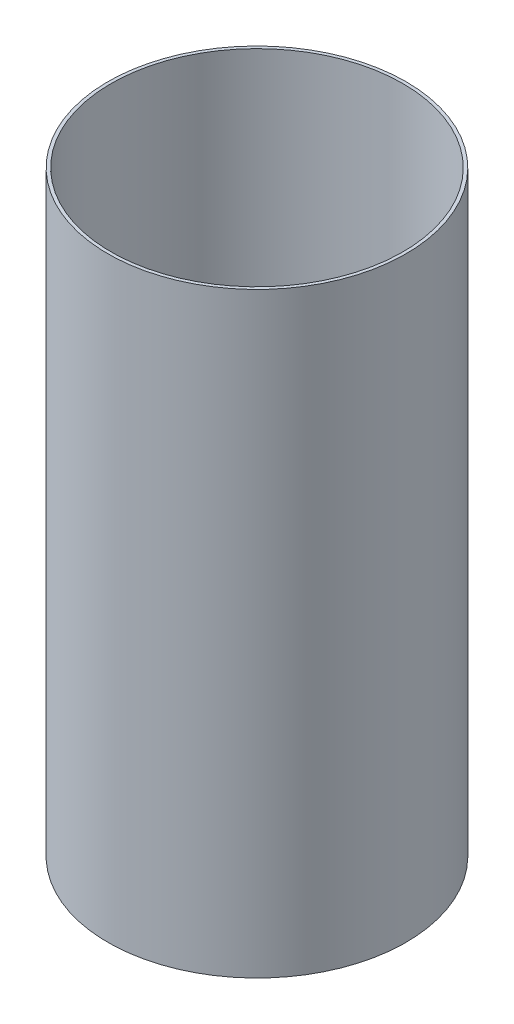
ISO-10303-21;
HEADER;
FILE_DESCRIPTION(('STEP AP214'),'2;1');
FILE_NAME('part.step','',(''),(''),'','','');
FILE_SCHEMA(('AUTOMOTIVE_DESIGN { 1 0 10303 214 1 1 1 1 }'));
ENDSEC;
DATA;
#1=APPLICATION_CONTEXT('core data for automotive mechanical design processes');
#2=APPLICATION_PROTOCOL_DEFINITION('international standard','automotive_design',2000,#1);
#3=PRODUCT_CONTEXT('',#1,'mechanical');
#4=PRODUCT('Part','Part','',(#3));
#5=PRODUCT_RELATED_PRODUCT_CATEGORY('part','',(#4));
#6=PRODUCT_DEFINITION_FORMATION('','',#4);
#7=PRODUCT_DEFINITION_CONTEXT('part definition',#1,'design');
#8=PRODUCT_DEFINITION('design','',#6,#7);
#9=PRODUCT_DEFINITION_SHAPE('','',#8);
#10=(LENGTH_UNIT() NAMED_UNIT(*) SI_UNIT(.MILLI.,.METRE.));
#11=(NAMED_UNIT(*) PLANE_ANGLE_UNIT() SI_UNIT($,.RADIAN.));
#12=(NAMED_UNIT(*) SI_UNIT($,.STERADIAN.) SOLID_ANGLE_UNIT());
#13=UNCERTAINTY_MEASURE_WITH_UNIT(LENGTH_MEASURE(1.E-05),#10,'distance_accuracy_value','');
#14=(GEOMETRIC_REPRESENTATION_CONTEXT(3) GLOBAL_UNCERTAINTY_ASSIGNED_CONTEXT((#13)) GLOBAL_UNIT_ASSIGNED_CONTEXT((#10,
#11,#12)) REPRESENTATION_CONTEXT('',''));
#15=CARTESIAN_POINT('',(0.,0.,0.));
#16=DIRECTION('',(0.,0.,1.));
#17=DIRECTION('',(1.,0.,0.));
#18=AXIS2_PLACEMENT_3D('',#15,#16,#17);
#19=CARTESIAN_POINT('',(0.,313.4,0.));
#20=DIRECTION('',(0.,1.,0.));
#21=DIRECTION('',(0.,0.,1.));
#22=AXIS2_PLACEMENT_3D('',#19,#20,#21);
#23=PLANE('',#22);
#24=CARTESIAN_POINT('',(0.,313.4,0.));
#25=DIRECTION('',(0.,1.,0.));
#26=DIRECTION('',(0.,0.,1.));
#27=AXIS2_PLACEMENT_3D('',#24,#25,#26);
#28=CIRCLE('',#27,78.35);
#29=CARTESIAN_POINT('',(0.,313.4,-78.35));
#30=VERTEX_POINT('',#29);
#31=EDGE_CURVE('E10',#30,#30,#28,.T.);
#32=ORIENTED_EDGE('',*,*,#31,.T.);
#33=EDGE_LOOP('',(#32));
#34=FACE_BOUND('',#33,.T.);
#35=CARTESIAN_POINT('',(0.,313.4,0.));
#36=DIRECTION('',(0.,1.,0.));
#37=DIRECTION('',(0.,0.,1.));
#38=AXIS2_PLACEMENT_3D('',#35,#36,#37);
#39=CIRCLE('',#38,76.67);
#40=CARTESIAN_POINT('',(0.,313.4,-76.67));
#41=VERTEX_POINT('',#40);
#42=EDGE_CURVE('E47',#41,#41,#39,.T.);
#43=ORIENTED_EDGE('',*,*,#42,.F.);
#44=EDGE_LOOP('',(#43));
#45=FACE_BOUND('',#44,.T.);
#46=ADVANCED_FACE('F36',(#34,#45),#23,.T.);
#47=CARTESIAN_POINT('',(0.,0.,0.));
#48=DIRECTION('',(0.,1.,0.));
#49=DIRECTION('',(0.,0.,1.));
#50=AXIS2_PLACEMENT_3D('',#47,#48,#49);
#51=PLANE('',#50);
#52=CARTESIAN_POINT('',(0.,0.,0.));
#53=DIRECTION('',(0.,1.,0.));
#54=DIRECTION('',(0.,0.,1.));
#55=AXIS2_PLACEMENT_3D('',#52,#53,#54);
#56=CIRCLE('',#55,78.35);
#57=CARTESIAN_POINT('',(0.,0.,-78.35));
#58=VERTEX_POINT('',#57);
#59=EDGE_CURVE('E40',#58,#58,#56,.T.);
#60=ORIENTED_EDGE('',*,*,#59,.F.);
#61=EDGE_LOOP('',(#60));
#62=FACE_BOUND('',#61,.T.);
#63=CARTESIAN_POINT('',(0.,0.,0.));
#64=DIRECTION('',(0.,1.,0.));
#65=DIRECTION('',(0.,0.,1.));
#66=AXIS2_PLACEMENT_3D('',#63,#64,#65);
#67=CIRCLE('',#66,76.67);
#68=CARTESIAN_POINT('',(0.,0.,-76.67));
#69=VERTEX_POINT('',#68);
#70=EDGE_CURVE('E49',#69,#69,#67,.T.);
#71=ORIENTED_EDGE('',*,*,#70,.T.);
#72=EDGE_LOOP('',(#71));
#73=FACE_BOUND('',#72,.T.);
#74=ADVANCED_FACE('F59',(#62,#73),#51,.F.);
#75=CARTESIAN_POINT('',(0.,313.4,0.));
#76=DIRECTION('',(0.,-1.,0.));
#77=DIRECTION('',(0.,0.,-1.));
#78=AXIS2_PLACEMENT_3D('',#75,#76,#77);
#79=CYLINDRICAL_SURFACE('',#78,78.35);
#80=CARTESIAN_POINT('',(0.,313.4,-78.35));
#81=CARTESIAN_POINT('',(0.,310.135416666667,-78.35));
#82=CARTESIAN_POINT('',(0.,306.870833333333,-78.35));
#83=CARTESIAN_POINT('',(0.,300.341666666667,-78.35));
#84=CARTESIAN_POINT('',(0.,297.077083333333,-78.35));
#85=CARTESIAN_POINT('',(0.,290.547916666667,-78.35));
#86=CARTESIAN_POINT('',(0.,287.283333333333,-78.35));
#87=CARTESIAN_POINT('',(0.,280.754166666667,-78.35));
#88=CARTESIAN_POINT('',(0.,277.489583333333,-78.35));
#89=CARTESIAN_POINT('',(0.,270.960416666667,-78.35));
#90=CARTESIAN_POINT('',(0.,267.695833333333,-78.35));
#91=CARTESIAN_POINT('',(0.,261.166666666667,-78.35));
#92=CARTESIAN_POINT('',(0.,257.902083333333,-78.35));
#93=CARTESIAN_POINT('',(0.,251.372916666667,-78.35));
#94=CARTESIAN_POINT('',(0.,248.108333333333,-78.35));
#95=CARTESIAN_POINT('',(0.,241.579166666667,-78.35));
#96=CARTESIAN_POINT('',(0.,238.314583333333,-78.35));
#97=CARTESIAN_POINT('',(0.,231.785416666667,-78.35));
#98=CARTESIAN_POINT('',(0.,228.520833333333,-78.35));
#99=CARTESIAN_POINT('',(0.,221.991666666667,-78.35));
#100=CARTESIAN_POINT('',(0.,218.727083333333,-78.35));
#101=CARTESIAN_POINT('',(0.,212.197916666667,-78.35));
#102=CARTESIAN_POINT('',(0.,208.933333333333,-78.35));
#103=CARTESIAN_POINT('',(0.,202.404166666667,-78.35));
#104=CARTESIAN_POINT('',(0.,199.139583333333,-78.35));
#105=CARTESIAN_POINT('',(0.,192.610416666667,-78.35));
#106=CARTESIAN_POINT('',(0.,189.345833333333,-78.35));
#107=CARTESIAN_POINT('',(0.,182.816666666667,-78.35));
#108=CARTESIAN_POINT('',(0.,179.552083333333,-78.35));
#109=CARTESIAN_POINT('',(0.,173.022916666667,-78.35));
#110=CARTESIAN_POINT('',(0.,169.758333333333,-78.35));
#111=CARTESIAN_POINT('',(0.,163.229166666667,-78.35));
#112=CARTESIAN_POINT('',(0.,159.964583333333,-78.35));
#113=CARTESIAN_POINT('',(0.,153.435416666667,-78.35));
#114=CARTESIAN_POINT('',(0.,150.170833333333,-78.35));
#115=CARTESIAN_POINT('',(0.,143.641666666667,-78.35));
#116=CARTESIAN_POINT('',(0.,140.377083333333,-78.35));
#117=CARTESIAN_POINT('',(0.,133.847916666667,-78.35));
#118=CARTESIAN_POINT('',(0.,130.583333333333,-78.35));
#119=CARTESIAN_POINT('',(0.,124.054166666667,-78.35));
#120=CARTESIAN_POINT('',(0.,120.789583333333,-78.35));
#121=CARTESIAN_POINT('',(0.,114.260416666667,-78.35));
#122=CARTESIAN_POINT('',(0.,110.995833333333,-78.35));
#123=CARTESIAN_POINT('',(0.,104.466666666667,-78.35));
#124=CARTESIAN_POINT('',(0.,101.202083333333,-78.35));
#125=CARTESIAN_POINT('',(0.,94.6729166666666,-78.35));
#126=CARTESIAN_POINT('',(0.,91.4083333333333,-78.35));
#127=CARTESIAN_POINT('',(0.,84.8791666666666,-78.35));
#128=CARTESIAN_POINT('',(0.,81.6145833333333,-78.35));
#129=CARTESIAN_POINT('',(0.,75.0854166666666,-78.35));
#130=CARTESIAN_POINT('',(0.,71.8208333333333,-78.35));
#131=CARTESIAN_POINT('',(0.,65.2916666666666,-78.35));
#132=CARTESIAN_POINT('',(0.,62.0270833333333,-78.35));
#133=CARTESIAN_POINT('',(0.,55.4979166666667,-78.35));
#134=CARTESIAN_POINT('',(0.,52.2333333333333,-78.35));
#135=CARTESIAN_POINT('',(0.,45.7041666666667,-78.35));
#136=CARTESIAN_POINT('',(0.,42.4395833333334,-78.35));
#137=CARTESIAN_POINT('',(0.,35.9104166666667,-78.35));
#138=CARTESIAN_POINT('',(0.,32.6458333333333,-78.35));
#139=CARTESIAN_POINT('',(0.,26.1166666666667,-78.35));
#140=CARTESIAN_POINT('',(0.,22.8520833333333,-78.35));
#141=CARTESIAN_POINT('',(0.,16.3229166666667,-78.35));
#142=CARTESIAN_POINT('',(0.,13.0583333333333,-78.35));
#143=CARTESIAN_POINT('',(0.,6.52916666666666,-78.35));
#144=CARTESIAN_POINT('',(0.,3.26458333333333,-78.35));
#145=CARTESIAN_POINT('',(0.,0.,-78.35));
#146=B_SPLINE_CURVE_WITH_KNOTS('',3,(#80,#81,#82,#83,#84,#85,#86,#87,#88,#89,#90,#91,#92,#93,
#94,#95,#96,#97,#98,#99,#100,#101,#102,#103,#104,#105,#106,#107,#108,#109,#110,#111,#112,#113,
#114,#115,#116,#117,#118,#119,#120,#121,#122,#123,#124,#125,#126,#127,#128,#129,#130,#131,#132,
#133,#134,#135,#136,#137,#138,#139,#140,#141,#142,#143,#144,#145),.UNSPECIFIED.,.F.,.F.,(4,2,2,
2,2,2,2,2,2,2,2,2,2,2,2,2,2,2,2,2,2,2,2,2,2,2,2,2,2,2,2,2,4),(0.,9.79375000000005,19.5875,
29.38125,39.175,48.96875,58.7625,68.55625,78.35,88.14375,97.9375,107.73125,117.525,127.31875,
137.1125,146.90625,156.7,166.49375,176.2875,186.08125,195.875,205.66875,215.4625,225.25625,
235.05,244.84375,254.6375,264.43125,274.225,284.01875,293.8125,303.60625,313.4),.UNSPECIFIED.);
#147=EDGE_CURVE('BSEAM38',#30,#58,#146,.T.);
#148=ORIENTED_EDGE('',*,*,#31,.F.);
#149=ORIENTED_EDGE('',*,*,#59,.T.);
#150=ORIENTED_EDGE('',*,*,#147,.T.);
#151=ORIENTED_EDGE('',*,*,#147,.F.);
#152=EDGE_LOOP('',(#148,#150,#149,#151));
#153=FACE_BOUND('',#152,.T.);
#154=ADVANCED_FACE('F38',(#153),#79,.T.);
#155=CARTESIAN_POINT('',(0.,313.4,0.));
#156=DIRECTION('',(0.,-1.,0.));
#157=DIRECTION('',(0.,0.,-1.));
#158=AXIS2_PLACEMENT_3D('',#155,#156,#157);
#159=CYLINDRICAL_SURFACE('',#158,76.67);
#160=CARTESIAN_POINT('',(0.,313.4,-76.67));
#161=CARTESIAN_POINT('',(0.,310.135416666667,-76.67));
#162=CARTESIAN_POINT('',(0.,306.870833333333,-76.67));
#163=CARTESIAN_POINT('',(0.,300.341666666667,-76.67));
#164=CARTESIAN_POINT('',(0.,297.077083333333,-76.67));
#165=CARTESIAN_POINT('',(0.,290.547916666667,-76.67));
#166=CARTESIAN_POINT('',(0.,287.283333333333,-76.67));
#167=CARTESIAN_POINT('',(0.,280.754166666667,-76.67));
#168=CARTESIAN_POINT('',(0.,277.489583333333,-76.67));
#169=CARTESIAN_POINT('',(0.,270.960416666667,-76.67));
#170=CARTESIAN_POINT('',(0.,267.695833333333,-76.67));
#171=CARTESIAN_POINT('',(0.,261.166666666667,-76.67));
#172=CARTESIAN_POINT('',(0.,257.902083333333,-76.67));
#173=CARTESIAN_POINT('',(0.,251.372916666667,-76.67));
#174=CARTESIAN_POINT('',(0.,248.108333333333,-76.67));
#175=CARTESIAN_POINT('',(0.,241.579166666667,-76.67));
#176=CARTESIAN_POINT('',(0.,238.314583333333,-76.67));
#177=CARTESIAN_POINT('',(0.,231.785416666667,-76.67));
#178=CARTESIAN_POINT('',(0.,228.520833333333,-76.67));
#179=CARTESIAN_POINT('',(0.,221.991666666667,-76.67));
#180=CARTESIAN_POINT('',(0.,218.727083333333,-76.67));
#181=CARTESIAN_POINT('',(0.,212.197916666667,-76.67));
#182=CARTESIAN_POINT('',(0.,208.933333333333,-76.67));
#183=CARTESIAN_POINT('',(0.,202.404166666667,-76.67));
#184=CARTESIAN_POINT('',(0.,199.139583333333,-76.67));
#185=CARTESIAN_POINT('',(0.,192.610416666667,-76.67));
#186=CARTESIAN_POINT('',(0.,189.345833333333,-76.67));
#187=CARTESIAN_POINT('',(0.,182.816666666667,-76.67));
#188=CARTESIAN_POINT('',(0.,179.552083333333,-76.67));
#189=CARTESIAN_POINT('',(0.,173.022916666667,-76.67));
#190=CARTESIAN_POINT('',(0.,169.758333333333,-76.67));
#191=CARTESIAN_POINT('',(0.,163.229166666667,-76.67));
#192=CARTESIAN_POINT('',(0.,159.964583333333,-76.67));
#193=CARTESIAN_POINT('',(0.,153.435416666667,-76.67));
#194=CARTESIAN_POINT('',(0.,150.170833333333,-76.67));
#195=CARTESIAN_POINT('',(0.,143.641666666667,-76.67));
#196=CARTESIAN_POINT('',(0.,140.377083333333,-76.67));
#197=CARTESIAN_POINT('',(0.,133.847916666667,-76.67));
#198=CARTESIAN_POINT('',(0.,130.583333333333,-76.67));
#199=CARTESIAN_POINT('',(0.,124.054166666667,-76.67));
#200=CARTESIAN_POINT('',(0.,120.789583333333,-76.67));
#201=CARTESIAN_POINT('',(0.,114.260416666667,-76.67));
#202=CARTESIAN_POINT('',(0.,110.995833333333,-76.67));
#203=CARTESIAN_POINT('',(0.,104.466666666667,-76.67));
#204=CARTESIAN_POINT('',(0.,101.202083333333,-76.67));
#205=CARTESIAN_POINT('',(0.,94.6729166666666,-76.67));
#206=CARTESIAN_POINT('',(0.,91.4083333333333,-76.67));
#207=CARTESIAN_POINT('',(0.,84.8791666666666,-76.67));
#208=CARTESIAN_POINT('',(0.,81.6145833333333,-76.67));
#209=CARTESIAN_POINT('',(0.,75.0854166666666,-76.67));
#210=CARTESIAN_POINT('',(0.,71.8208333333333,-76.67));
#211=CARTESIAN_POINT('',(0.,65.2916666666666,-76.67));
#212=CARTESIAN_POINT('',(0.,62.0270833333333,-76.67));
#213=CARTESIAN_POINT('',(0.,55.4979166666667,-76.67));
#214=CARTESIAN_POINT('',(0.,52.2333333333333,-76.67));
#215=CARTESIAN_POINT('',(0.,45.7041666666667,-76.67));
#216=CARTESIAN_POINT('',(0.,42.4395833333334,-76.67));
#217=CARTESIAN_POINT('',(0.,35.9104166666667,-76.67));
#218=CARTESIAN_POINT('',(0.,32.6458333333333,-76.67));
#219=CARTESIAN_POINT('',(0.,26.1166666666667,-76.67));
#220=CARTESIAN_POINT('',(0.,22.8520833333333,-76.67));
#221=CARTESIAN_POINT('',(0.,16.3229166666667,-76.67));
#222=CARTESIAN_POINT('',(0.,13.0583333333333,-76.67));
#223=CARTESIAN_POINT('',(0.,6.52916666666666,-76.67));
#224=CARTESIAN_POINT('',(0.,3.26458333333333,-76.67));
#225=CARTESIAN_POINT('',(0.,0.,-76.67));
#226=B_SPLINE_CURVE_WITH_KNOTS('',3,(#160,#161,#162,#163,#164,#165,#166,#167,#168,#169,#170,
#171,#172,#173,#174,#175,#176,#177,#178,#179,#180,#181,#182,#183,#184,#185,#186,#187,#188,#189,
#190,#191,#192,#193,#194,#195,#196,#197,#198,#199,#200,#201,#202,#203,#204,#205,#206,#207,#208,
#209,#210,#211,#212,#213,#214,#215,#216,#217,#218,#219,#220,#221,#222,#223,#224,#225),
.UNSPECIFIED.,.F.,.F.,(4,2,2,2,2,2,2,2,2,2,2,2,2,2,2,2,2,2,2,2,2,2,2,2,2,2,2,2,2,2,2,2,4),(0.,
9.79375000000005,19.5875,29.38125,39.175,48.96875,58.7625,68.55625,78.35,88.14375,97.9375,
107.73125,117.525,127.31875,137.1125,146.90625,156.7,166.49375,176.2875,186.08125,195.875,
205.66875,215.4625,225.25625,235.05,244.84375,254.6375,264.43125,274.225,284.01875,293.8125,
303.60625,313.4),.UNSPECIFIED.);
#227=EDGE_CURVE('BSEAM55',#41,#69,#226,.T.);
#228=ORIENTED_EDGE('',*,*,#42,.T.);
#229=ORIENTED_EDGE('',*,*,#70,.F.);
#230=ORIENTED_EDGE('',*,*,#227,.T.);
#231=ORIENTED_EDGE('',*,*,#227,.F.);
#232=EDGE_LOOP('',(#228,#230,#229,#231));
#233=FACE_BOUND('',#232,.T.);
#234=ADVANCED_FACE('F55',(#233),#159,.F.);
#235=CLOSED_SHELL('',(#46,#74,#154,#234));
#236=MANIFOLD_SOLID_BREP('B2',#235);
#237=ADVANCED_BREP_SHAPE_REPRESENTATION('',(#18,#236),#14);
#238=SHAPE_DEFINITION_REPRESENTATION(#9,#237);
ENDSEC;
END-ISO-10303-21;
